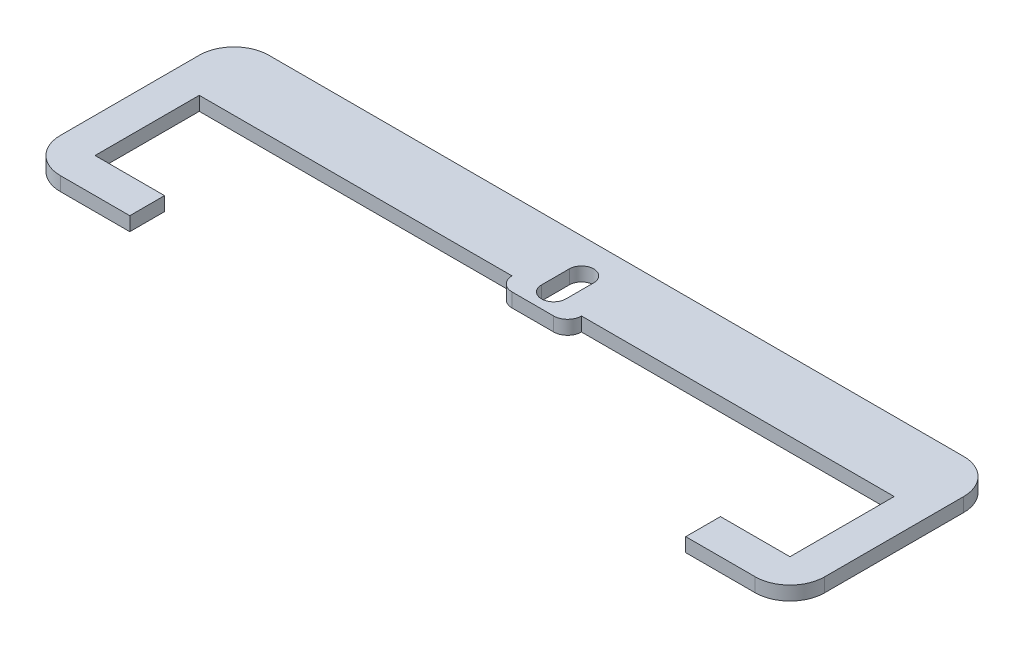
ISO-10303-21;
HEADER;
FILE_DESCRIPTION(('STEP AP214'),'2;1');
FILE_NAME('part.step','',(''),(''),'','','');
FILE_SCHEMA(('AUTOMOTIVE_DESIGN { 1 0 10303 214 1 1 1 1 }'));
ENDSEC;
DATA;
#1=APPLICATION_CONTEXT('core data for automotive mechanical design processes');
#2=APPLICATION_PROTOCOL_DEFINITION('international standard','automotive_design',2000,#1);
#3=PRODUCT_CONTEXT('',#1,'mechanical');
#4=PRODUCT('Part','Part','',(#3));
#5=PRODUCT_RELATED_PRODUCT_CATEGORY('part','',(#4));
#6=PRODUCT_DEFINITION_FORMATION('','',#4);
#7=PRODUCT_DEFINITION_CONTEXT('part definition',#1,'design');
#8=PRODUCT_DEFINITION('design','',#6,#7);
#9=PRODUCT_DEFINITION_SHAPE('','',#8);
#10=(LENGTH_UNIT() NAMED_UNIT(*) SI_UNIT(.MILLI.,.METRE.));
#11=(NAMED_UNIT(*) PLANE_ANGLE_UNIT() SI_UNIT($,.RADIAN.));
#12=(NAMED_UNIT(*) SI_UNIT($,.STERADIAN.) SOLID_ANGLE_UNIT());
#13=UNCERTAINTY_MEASURE_WITH_UNIT(LENGTH_MEASURE(1.E-05),#10,'distance_accuracy_value','');
#14=(GEOMETRIC_REPRESENTATION_CONTEXT(3) GLOBAL_UNCERTAINTY_ASSIGNED_CONTEXT((#13)) GLOBAL_UNIT_ASSIGNED_CONTEXT((#10,
#11,#12)) REPRESENTATION_CONTEXT('',''));
#15=CARTESIAN_POINT('',(0.,0.,0.));
#16=DIRECTION('',(0.,0.,1.));
#17=DIRECTION('',(1.,0.,0.));
#18=AXIS2_PLACEMENT_3D('',#15,#16,#17);
#19=CARTESIAN_POINT('',(127.,0.,-12.7));
#20=DIRECTION('',(0.,0.,-1.));
#21=DIRECTION('',(-1.,0.,0.));
#22=AXIS2_PLACEMENT_3D('',#19,#20,#21);
#23=PLANE('',#22);
#24=DIRECTION('',(0.,1.,0.));
#25=VECTOR('',#24,1.);
#26=CARTESIAN_POINT('',(12.7,0.,-12.7));
#27=LINE('',#26,#25);
#28=CARTESIAN_POINT('',(12.7,0.,-12.7));
#29=VERTEX_POINT('',#28);
#30=CARTESIAN_POINT('',(12.7,5.08,-12.7));
#31=VERTEX_POINT('',#30);
#32=EDGE_CURVE('E225',#29,#31,#27,.T.);
#33=ORIENTED_EDGE('',*,*,#32,.F.);
#34=DIRECTION('',(-1.,0.,0.));
#35=VECTOR('',#34,1.);
#36=CARTESIAN_POINT('',(127.,0.,-12.7));
#37=LINE('',#36,#35);
#38=CARTESIAN_POINT('',(127.,0.,-12.7));
#39=VERTEX_POINT('',#38);
#40=EDGE_CURVE('E273',#39,#29,#37,.T.);
#41=ORIENTED_EDGE('',*,*,#40,.F.);
#42=DIRECTION('',(0.,1.,0.));
#43=VECTOR('',#42,1.);
#44=CARTESIAN_POINT('',(127.,0.,-12.7));
#45=LINE('',#44,#43);
#46=CARTESIAN_POINT('',(127.,5.08,-12.7));
#47=VERTEX_POINT('',#46);
#48=EDGE_CURVE('E292',#39,#47,#45,.T.);
#49=ORIENTED_EDGE('',*,*,#48,.T.);
#50=DIRECTION('',(-1.,0.,0.));
#51=VECTOR('',#50,1.);
#52=CARTESIAN_POINT('',(127.,5.08,-12.7));
#53=LINE('',#52,#51);
#54=EDGE_CURVE('E265',#47,#31,#53,.T.);
#55=ORIENTED_EDGE('',*,*,#54,.T.);
#56=EDGE_LOOP('',(#33,#41,#49,#55));
#57=FACE_BOUND('',#56,.T.);
#58=ADVANCED_FACE('F32',(#57),#23,.F.);
#59=DIRECTION('',(0.,-1.,0.));
#60=VECTOR('',#59,1.);
#61=CARTESIAN_POINT('',(-12.7,0.,-12.7));
#62=LINE('',#61,#60);
#63=CARTESIAN_POINT('',(-12.7,5.08,-12.7));
#64=VERTEX_POINT('',#63);
#65=CARTESIAN_POINT('',(-12.7,0.,-12.7));
#66=VERTEX_POINT('',#65);
#67=EDGE_CURVE('E233',#64,#66,#62,.T.);
#68=ORIENTED_EDGE('',*,*,#67,.F.);
#69=CARTESIAN_POINT('',(-127.,5.08,-12.7));
#70=VERTEX_POINT('',#69);
#71=EDGE_CURVE('E285',#64,#70,#53,.T.);
#72=ORIENTED_EDGE('',*,*,#71,.T.);
#73=DIRECTION('',(0.,1.,0.));
#74=VECTOR('',#73,1.);
#75=CARTESIAN_POINT('',(-127.,0.,-12.7));
#76=LINE('',#75,#74);
#77=CARTESIAN_POINT('',(-127.,0.,-12.7));
#78=VERTEX_POINT('',#77);
#79=EDGE_CURVE('E288',#78,#70,#76,.T.);
#80=ORIENTED_EDGE('',*,*,#79,.F.);
#81=EDGE_CURVE('E272',#66,#78,#37,.T.);
#82=ORIENTED_EDGE('',*,*,#81,.F.);
#83=EDGE_LOOP('',(#68,#72,#80,#82));
#84=FACE_BOUND('',#83,.T.);
#85=ADVANCED_FACE('F392',(#84),#23,.F.);
#86=CARTESIAN_POINT('',(-139.7,5.08,38.1));
#87=DIRECTION('',(0.,0.,-1.));
#88=DIRECTION('',(-1.,0.,0.));
#89=AXIS2_PLACEMENT_3D('',#86,#87,#88);
#90=PLANE('',#89);
#91=DIRECTION('',(1.,0.,0.));
#92=VECTOR('',#91,1.);
#93=CARTESIAN_POINT('',(-139.7,5.08,38.1));
#94=LINE('',#93,#92);
#95=CARTESIAN_POINT('',(101.6,5.08,38.1));
#96=VERTEX_POINT('',#95);
#97=CARTESIAN_POINT('',(127.,5.08,38.1));
#98=VERTEX_POINT('',#97);
#99=EDGE_CURVE('E308',#96,#98,#94,.T.);
#100=ORIENTED_EDGE('',*,*,#99,.F.);
#101=DIRECTION('',(0.,1.,0.));
#102=VECTOR('',#101,1.);
#103=CARTESIAN_POINT('',(101.6,0.,38.1));
#104=LINE('',#103,#102);
#105=CARTESIAN_POINT('',(101.6,0.,38.1));
#106=VERTEX_POINT('',#105);
#107=EDGE_CURVE('E251',#106,#96,#104,.T.);
#108=ORIENTED_EDGE('',*,*,#107,.F.);
#109=DIRECTION('',(1.,0.,0.));
#110=VECTOR('',#109,1.);
#111=CARTESIAN_POINT('',(-139.7,0.,38.1));
#112=LINE('',#111,#110);
#113=CARTESIAN_POINT('',(127.,0.,38.1));
#114=VERTEX_POINT('',#113);
#115=EDGE_CURVE('E320',#106,#114,#112,.T.);
#116=ORIENTED_EDGE('',*,*,#115,.T.);
#117=DIRECTION('',(0.,-1.,0.));
#118=VECTOR('',#117,1.);
#119=CARTESIAN_POINT('',(127.,5.08,38.1));
#120=LINE('',#119,#118);
#121=EDGE_CURVE('E342',#114,#98,#120,.F.);
#122=ORIENTED_EDGE('',*,*,#121,.T.);
#123=EDGE_LOOP('',(#100,#108,#116,#122));
#124=FACE_BOUND('',#123,.T.);
#125=ADVANCED_FACE('F444',(#124),#90,.F.);
#126=CARTESIAN_POINT('',(127.,0.,25.4));
#127=DIRECTION('',(0.,0.,1.));
#128=DIRECTION('',(1.,0.,0.));
#129=AXIS2_PLACEMENT_3D('',#126,#127,#128);
#130=PLANE('',#129);
#131=DIRECTION('',(1.,0.,0.));
#132=VECTOR('',#131,1.);
#133=CARTESIAN_POINT('',(127.,0.,25.4));
#134=LINE('',#133,#132);
#135=CARTESIAN_POINT('',(101.6,0.,25.4));
#136=VERTEX_POINT('',#135);
#137=CARTESIAN_POINT('',(127.,0.,25.4));
#138=VERTEX_POINT('',#137);
#139=EDGE_CURVE('E264',#136,#138,#134,.T.);
#140=ORIENTED_EDGE('',*,*,#139,.F.);
#141=DIRECTION('',(0.,1.,0.));
#142=VECTOR('',#141,1.);
#143=CARTESIAN_POINT('',(101.6,0.,25.4));
#144=LINE('',#143,#142);
#145=CARTESIAN_POINT('',(101.6,5.08,25.4));
#146=VERTEX_POINT('',#145);
#147=EDGE_CURVE('E248',#136,#146,#144,.T.);
#148=ORIENTED_EDGE('',*,*,#147,.T.);
#149=DIRECTION('',(1.,0.,0.));
#150=VECTOR('',#149,1.);
#151=CARTESIAN_POINT('',(127.,5.08,25.4));
#152=LINE('',#151,#150);
#153=CARTESIAN_POINT('',(127.,5.08,25.4));
#154=VERTEX_POINT('',#153);
#155=EDGE_CURVE('E278',#146,#154,#152,.T.);
#156=ORIENTED_EDGE('',*,*,#155,.T.);
#157=DIRECTION('',(0.,1.,0.));
#158=VECTOR('',#157,1.);
#159=CARTESIAN_POINT('',(127.,0.,25.4));
#160=LINE('',#159,#158);
#161=EDGE_CURVE('E294',#138,#154,#160,.T.);
#162=ORIENTED_EDGE('',*,*,#161,.F.);
#163=EDGE_LOOP('',(#140,#148,#156,#162));
#164=FACE_BOUND('',#163,.T.);
#165=ADVANCED_FACE('F451',(#164),#130,.F.);
#166=CARTESIAN_POINT('',(139.7,5.08,38.1));
#167=DIRECTION('',(-1.,0.,0.));
#168=DIRECTION('',(0.,0.,1.));
#169=AXIS2_PLACEMENT_3D('',#166,#167,#168);
#170=PLANE('',#169);
#171=DIRECTION('',(0.,0.,-1.));
#172=VECTOR('',#171,1.);
#173=CARTESIAN_POINT('',(139.7,5.08,38.1));
#174=LINE('',#173,#172);
#175=CARTESIAN_POINT('',(139.7,5.08,25.4));
#176=VERTEX_POINT('',#175);
#177=CARTESIAN_POINT('',(139.7,5.08,-25.4));
#178=VERTEX_POINT('',#177);
#179=EDGE_CURVE('E299',#176,#178,#174,.T.);
#180=ORIENTED_EDGE('',*,*,#179,.F.);
#181=DIRECTION('',(0.,-1.,0.));
#182=VECTOR('',#181,1.);
#183=CARTESIAN_POINT('',(139.7,5.08,25.4));
#184=LINE('',#183,#182);
#185=CARTESIAN_POINT('',(139.7,0.,25.4));
#186=VERTEX_POINT('',#185);
#187=EDGE_CURVE('E359',#176,#186,#184,.T.);
#188=ORIENTED_EDGE('',*,*,#187,.T.);
#189=DIRECTION('',(0.,0.,-1.));
#190=VECTOR('',#189,1.);
#191=CARTESIAN_POINT('',(139.7,0.,38.1));
#192=LINE('',#191,#190);
#193=CARTESIAN_POINT('',(139.7,0.,-25.4));
#194=VERTEX_POINT('',#193);
#195=EDGE_CURVE('E291',#186,#194,#192,.T.);
#196=ORIENTED_EDGE('',*,*,#195,.T.);
#197=DIRECTION('',(0.,-1.,0.));
#198=VECTOR('',#197,1.);
#199=CARTESIAN_POINT('',(139.7,5.08,-25.4));
#200=LINE('',#199,#198);
#201=EDGE_CURVE('E339',#194,#178,#200,.F.);
#202=ORIENTED_EDGE('',*,*,#201,.T.);
#203=EDGE_LOOP('',(#180,#188,#196,#202));
#204=FACE_BOUND('',#203,.T.);
#205=ADVANCED_FACE('F437',(#204),#170,.F.);
#206=CARTESIAN_POINT('',(-139.7,5.08,-38.1));
#207=DIRECTION('',(0.,0.,1.));
#208=DIRECTION('',(1.,0.,0.));
#209=AXIS2_PLACEMENT_3D('',#206,#207,#208);
#210=PLANE('',#209);
#211=DIRECTION('',(-1.,0.,0.));
#212=VECTOR('',#211,1.);
#213=CARTESIAN_POINT('',(-139.7,0.,-38.1));
#214=LINE('',#213,#212);
#215=CARTESIAN_POINT('',(127.,0.,-38.1));
#216=VERTEX_POINT('',#215);
#217=CARTESIAN_POINT('',(-127.,0.,-38.1));
#218=VERTEX_POINT('',#217);
#219=EDGE_CURVE('E314',#216,#218,#214,.T.);
#220=ORIENTED_EDGE('',*,*,#219,.T.);
#221=DIRECTION('',(0.,-1.,0.));
#222=VECTOR('',#221,1.);
#223=CARTESIAN_POINT('',(-127.,5.08,-38.1));
#224=LINE('',#223,#222);
#225=CARTESIAN_POINT('',(-127.,5.08,-38.1));
#226=VERTEX_POINT('',#225);
#227=EDGE_CURVE('E333',#218,#226,#224,.F.);
#228=ORIENTED_EDGE('',*,*,#227,.T.);
#229=DIRECTION('',(-1.,0.,0.));
#230=VECTOR('',#229,1.);
#231=CARTESIAN_POINT('',(-139.7,5.08,-38.1));
#232=LINE('',#231,#230);
#233=CARTESIAN_POINT('',(127.,5.08,-38.1));
#234=VERTEX_POINT('',#233);
#235=EDGE_CURVE('E301',#234,#226,#232,.T.);
#236=ORIENTED_EDGE('',*,*,#235,.F.);
#237=DIRECTION('',(0.,-1.,0.));
#238=VECTOR('',#237,1.);
#239=CARTESIAN_POINT('',(127.,5.08,-38.1));
#240=LINE('',#239,#238);
#241=EDGE_CURVE('E330',#234,#216,#240,.T.);
#242=ORIENTED_EDGE('',*,*,#241,.T.);
#243=EDGE_LOOP('',(#220,#228,#236,#242));
#244=FACE_BOUND('',#243,.T.);
#245=ADVANCED_FACE('F425',(#244),#210,.F.);
#246=CARTESIAN_POINT('',(-139.7,5.08,38.1));
#247=DIRECTION('',(1.,0.,0.));
#248=DIRECTION('',(0.,0.,-1.));
#249=AXIS2_PLACEMENT_3D('',#246,#247,#248);
#250=PLANE('',#249);
#251=DIRECTION('',(0.,0.,1.));
#252=VECTOR('',#251,1.);
#253=CARTESIAN_POINT('',(-139.7,0.,38.1));
#254=LINE('',#253,#252);
#255=CARTESIAN_POINT('',(-139.7,0.,-25.4));
#256=VERTEX_POINT('',#255);
#257=CARTESIAN_POINT('',(-139.7,0.,25.4));
#258=VERTEX_POINT('',#257);
#259=EDGE_CURVE('E317',#256,#258,#254,.T.);
#260=ORIENTED_EDGE('',*,*,#259,.T.);
#261=DIRECTION('',(0.,-1.,0.));
#262=VECTOR('',#261,1.);
#263=CARTESIAN_POINT('',(-139.7,5.08,25.4));
#264=LINE('',#263,#262);
#265=CARTESIAN_POINT('',(-139.7,5.08,25.4));
#266=VERTEX_POINT('',#265);
#267=EDGE_CURVE('E353',#258,#266,#264,.F.);
#268=ORIENTED_EDGE('',*,*,#267,.T.);
#269=DIRECTION('',(0.,0.,1.));
#270=VECTOR('',#269,1.);
#271=CARTESIAN_POINT('',(-139.7,5.08,38.1));
#272=LINE('',#271,#270);
#273=CARTESIAN_POINT('',(-139.7,5.08,-25.4));
#274=VERTEX_POINT('',#273);
#275=EDGE_CURVE('E305',#274,#266,#272,.T.);
#276=ORIENTED_EDGE('',*,*,#275,.F.);
#277=DIRECTION('',(0.,-1.,0.));
#278=VECTOR('',#277,1.);
#279=CARTESIAN_POINT('',(-139.7,5.08,-25.4));
#280=LINE('',#279,#278);
#281=EDGE_CURVE('E312',#274,#256,#280,.T.);
#282=ORIENTED_EDGE('',*,*,#281,.T.);
#283=EDGE_LOOP('',(#260,#268,#276,#282));
#284=FACE_BOUND('',#283,.T.);
#285=ADVANCED_FACE('F416',(#284),#250,.F.);
#286=CARTESIAN_POINT('',(-127.,0.,38.1));
#287=VERTEX_POINT('',#286);
#288=CARTESIAN_POINT('',(-101.6,0.,38.1));
#289=VERTEX_POINT('',#288);
#290=EDGE_CURVE('E302',#287,#289,#112,.T.);
#291=ORIENTED_EDGE('',*,*,#290,.T.);
#292=DIRECTION('',(0.,1.,0.));
#293=VECTOR('',#292,1.);
#294=CARTESIAN_POINT('',(-101.6,0.,38.1));
#295=LINE('',#294,#293);
#296=CARTESIAN_POINT('',(-101.6,5.08,38.1));
#297=VERTEX_POINT('',#296);
#298=EDGE_CURVE('E254',#289,#297,#295,.T.);
#299=ORIENTED_EDGE('',*,*,#298,.T.);
#300=CARTESIAN_POINT('',(-127.,5.08,38.1));
#301=VERTEX_POINT('',#300);
#302=EDGE_CURVE('E309',#301,#297,#94,.T.);
#303=ORIENTED_EDGE('',*,*,#302,.F.);
#304=DIRECTION('',(0.,-1.,0.));
#305=VECTOR('',#304,1.);
#306=CARTESIAN_POINT('',(-127.,5.08,38.1));
#307=LINE('',#306,#305);
#308=EDGE_CURVE('E345',#301,#287,#307,.T.);
#309=ORIENTED_EDGE('',*,*,#308,.T.);
#310=EDGE_LOOP('',(#291,#299,#303,#309));
#311=FACE_BOUND('',#310,.T.);
#312=ADVANCED_FACE('F410',(#311),#90,.F.);
#313=CARTESIAN_POINT('',(0.,5.08,0.));
#314=DIRECTION('',(0.,-1.,0.));
#315=DIRECTION('',(0.,0.,-1.));
#316=AXIS2_PLACEMENT_3D('',#313,#314,#315);
#317=PLANE('',#316);
#318=DIRECTION('',(0.,0.,-1.));
#319=VECTOR('',#318,1.);
#320=CARTESIAN_POINT('',(4.445,5.08,-15.24));
#321=LINE('',#320,#319);
#322=CARTESIAN_POINT('',(4.445,5.08,-15.24));
#323=VERTEX_POINT('',#322);
#324=CARTESIAN_POINT('',(4.445,5.08,-25.4));
#325=VERTEX_POINT('',#324);
#326=EDGE_CURVE('E219',#323,#325,#321,.T.);
#327=ORIENTED_EDGE('',*,*,#326,.F.);
#328=CARTESIAN_POINT('',(0.,5.08,-15.24));
#329=DIRECTION('',(0.,1.,0.));
#330=DIRECTION('',(0.,0.,1.));
#331=AXIS2_PLACEMENT_3D('',#328,#329,#330);
#332=CIRCLE('',#331,4.445);
#333=CARTESIAN_POINT('',(-4.445,5.08,-15.24));
#334=VERTEX_POINT('',#333);
#335=EDGE_CURVE('E47',#334,#323,#332,.T.);
#336=ORIENTED_EDGE('',*,*,#335,.F.);
#337=DIRECTION('',(0.,0.,1.));
#338=VECTOR('',#337,1.);
#339=CARTESIAN_POINT('',(-4.445,5.08,-15.24));
#340=LINE('',#339,#338);
#341=CARTESIAN_POINT('',(-4.445,5.08,-25.4));
#342=VERTEX_POINT('',#341);
#343=EDGE_CURVE('E210',#342,#334,#340,.T.);
#344=ORIENTED_EDGE('',*,*,#343,.F.);
#345=CARTESIAN_POINT('',(0.,5.08,-25.4));
#346=DIRECTION('',(0.,1.,0.));
#347=DIRECTION('',(0.,0.,1.));
#348=AXIS2_PLACEMENT_3D('',#345,#346,#347);
#349=CIRCLE('',#348,4.445);
#350=EDGE_CURVE('E213',#325,#342,#349,.T.);
#351=ORIENTED_EDGE('',*,*,#350,.F.);
#352=EDGE_LOOP('',(#327,#336,#344,#351));
#353=FACE_BOUND('',#352,.T.);
#354=ORIENTED_EDGE('',*,*,#71,.F.);
#355=CARTESIAN_POINT('',(-7.62,5.08,-12.7));
#356=DIRECTION('',(0.,-1.,0.));
#357=DIRECTION('',(0.,0.,-1.));
#358=AXIS2_PLACEMENT_3D('',#355,#356,#357);
#359=CIRCLE('',#358,5.08);
#360=CARTESIAN_POINT('',(-7.62,5.08,-7.61999999999999));
#361=VERTEX_POINT('',#360);
#362=EDGE_CURVE('E11',#64,#361,#359,.F.);
#363=ORIENTED_EDGE('',*,*,#362,.T.);
#364=DIRECTION('',(-1.,0.,0.));
#365=VECTOR('',#364,1.);
#366=CARTESIAN_POINT('',(-12.7,5.08,-7.61999999999999));
#367=LINE('',#366,#365);
#368=CARTESIAN_POINT('',(7.62,5.08,-7.61999999999999));
#369=VERTEX_POINT('',#368);
#370=EDGE_CURVE('E229',#369,#361,#367,.T.);
#371=ORIENTED_EDGE('',*,*,#370,.F.);
#372=CARTESIAN_POINT('',(7.62,5.08,-12.7));
#373=DIRECTION('',(0.,-1.,0.));
#374=DIRECTION('',(0.,0.,-1.));
#375=AXIS2_PLACEMENT_3D('',#372,#373,#374);
#376=CIRCLE('',#375,5.08);
#377=EDGE_CURVE('E40',#369,#31,#376,.F.);
#378=ORIENTED_EDGE('',*,*,#377,.T.);
#379=ORIENTED_EDGE('',*,*,#54,.F.);
#380=DIRECTION('',(0.,0.,-1.));
#381=VECTOR('',#380,1.);
#382=CARTESIAN_POINT('',(127.,5.08,25.4));
#383=LINE('',#382,#381);
#384=EDGE_CURVE('E282',#154,#47,#383,.T.);
#385=ORIENTED_EDGE('',*,*,#384,.F.);
#386=ORIENTED_EDGE('',*,*,#155,.F.);
#387=DIRECTION('',(0.,0.,-1.));
#388=VECTOR('',#387,1.);
#389=CARTESIAN_POINT('',(101.6,5.08,38.1));
#390=LINE('',#389,#388);
#391=EDGE_CURVE('E236',#96,#146,#390,.T.);
#392=ORIENTED_EDGE('',*,*,#391,.F.);
#393=ORIENTED_EDGE('',*,*,#99,.T.);
#394=CARTESIAN_POINT('',(127.,5.08,25.4));
#395=DIRECTION('',(0.,-1.,0.));
#396=DIRECTION('',(0.,0.,-1.));
#397=AXIS2_PLACEMENT_3D('',#394,#395,#396);
#398=CIRCLE('',#397,12.7);
#399=EDGE_CURVE('E355',#98,#176,#398,.F.);
#400=ORIENTED_EDGE('',*,*,#399,.T.);
#401=ORIENTED_EDGE('',*,*,#179,.T.);
#402=CARTESIAN_POINT('',(127.,5.08,-25.4));
#403=DIRECTION('',(0.,-1.,0.));
#404=DIRECTION('',(0.,0.,-1.));
#405=AXIS2_PLACEMENT_3D('',#402,#403,#404);
#406=CIRCLE('',#405,12.7);
#407=EDGE_CURVE('E335',#178,#234,#406,.F.);
#408=ORIENTED_EDGE('',*,*,#407,.T.);
#409=ORIENTED_EDGE('',*,*,#235,.T.);
#410=CARTESIAN_POINT('',(-127.,5.08,-25.4));
#411=DIRECTION('',(0.,-1.,0.));
#412=DIRECTION('',(0.,0.,-1.));
#413=AXIS2_PLACEMENT_3D('',#410,#411,#412);
#414=CIRCLE('',#413,12.7);
#415=EDGE_CURVE('E337',#226,#274,#414,.F.);
#416=ORIENTED_EDGE('',*,*,#415,.T.);
#417=ORIENTED_EDGE('',*,*,#275,.T.);
#418=CARTESIAN_POINT('',(-127.,5.08,25.4));
#419=DIRECTION('',(0.,-1.,0.));
#420=DIRECTION('',(0.,0.,-1.));
#421=AXIS2_PLACEMENT_3D('',#418,#419,#420);
#422=CIRCLE('',#421,12.7);
#423=EDGE_CURVE('E357',#266,#301,#422,.F.);
#424=ORIENTED_EDGE('',*,*,#423,.T.);
#425=ORIENTED_EDGE('',*,*,#302,.T.);
#426=DIRECTION('',(0.,0.,1.));
#427=VECTOR('',#426,1.);
#428=CARTESIAN_POINT('',(-101.6,5.08,38.1));
#429=LINE('',#428,#427);
#430=CARTESIAN_POINT('',(-101.6,5.08,25.4));
#431=VERTEX_POINT('',#430);
#432=EDGE_CURVE('E245',#431,#297,#429,.T.);
#433=ORIENTED_EDGE('',*,*,#432,.F.);
#434=CARTESIAN_POINT('',(-127.,5.08,25.4));
#435=VERTEX_POINT('',#434);
#436=EDGE_CURVE('E279',#435,#431,#152,.T.);
#437=ORIENTED_EDGE('',*,*,#436,.F.);
#438=DIRECTION('',(0.,0.,1.));
#439=VECTOR('',#438,1.);
#440=CARTESIAN_POINT('',(-127.,5.08,25.4));
#441=LINE('',#440,#439);
#442=EDGE_CURVE('E253',#70,#435,#441,.T.);
#443=ORIENTED_EDGE('',*,*,#442,.F.);
#444=EDGE_LOOP('',(#354,#363,#371,#378,#379,#385,#386,#392,#393,#400,#401,#408,#409,#416,#417,
#424,#425,#433,#437,#443));
#445=FACE_BOUND('',#444,.T.);
#446=ADVANCED_FACE('F375',(#353,#445),#317,.F.);
#447=CARTESIAN_POINT('',(0.,0.,0.));
#448=DIRECTION('',(0.,-1.,0.));
#449=DIRECTION('',(0.,0.,-1.));
#450=AXIS2_PLACEMENT_3D('',#447,#448,#449);
#451=PLANE('',#450);
#452=CARTESIAN_POINT('',(0.,0.,-15.24));
#453=DIRECTION('',(0.,1.,0.));
#454=DIRECTION('',(0.,0.,1.));
#455=AXIS2_PLACEMENT_3D('',#452,#453,#454);
#456=CIRCLE('',#455,4.445);
#457=CARTESIAN_POINT('',(-4.445,0.,-15.24));
#458=VERTEX_POINT('',#457);
#459=CARTESIAN_POINT('',(4.445,0.,-15.24));
#460=VERTEX_POINT('',#459);
#461=EDGE_CURVE('E194',#458,#460,#456,.T.);
#462=ORIENTED_EDGE('',*,*,#461,.T.);
#463=DIRECTION('',(0.,0.,-1.));
#464=VECTOR('',#463,1.);
#465=CARTESIAN_POINT('',(4.445,0.,-15.24));
#466=LINE('',#465,#464);
#467=CARTESIAN_POINT('',(4.445,0.,-25.4));
#468=VERTEX_POINT('',#467);
#469=EDGE_CURVE('E203',#460,#468,#466,.T.);
#470=ORIENTED_EDGE('',*,*,#469,.T.);
#471=CARTESIAN_POINT('',(0.,0.,-25.4));
#472=DIRECTION('',(0.,1.,0.));
#473=DIRECTION('',(0.,0.,1.));
#474=AXIS2_PLACEMENT_3D('',#471,#472,#473);
#475=CIRCLE('',#474,4.445);
#476=CARTESIAN_POINT('',(-4.445,0.,-25.4));
#477=VERTEX_POINT('',#476);
#478=EDGE_CURVE('E55',#468,#477,#475,.T.);
#479=ORIENTED_EDGE('',*,*,#478,.T.);
#480=DIRECTION('',(0.,0.,1.));
#481=VECTOR('',#480,1.);
#482=CARTESIAN_POINT('',(-4.445,0.,-15.24));
#483=LINE('',#482,#481);
#484=EDGE_CURVE('E200',#477,#458,#483,.T.);
#485=ORIENTED_EDGE('',*,*,#484,.T.);
#486=EDGE_LOOP('',(#462,#470,#479,#485));
#487=FACE_BOUND('',#486,.T.);
#488=DIRECTION('',(1.,0.,0.));
#489=VECTOR('',#488,1.);
#490=CARTESIAN_POINT('',(-12.7,0.,-7.61999999999999));
#491=LINE('',#490,#489);
#492=CARTESIAN_POINT('',(-7.62000000000001,0.,-7.61999999999999));
#493=VERTEX_POINT('',#492);
#494=CARTESIAN_POINT('',(7.61999999999999,0.,-7.61999999999999));
#495=VERTEX_POINT('',#494);
#496=EDGE_CURVE('E232',#493,#495,#491,.T.);
#497=ORIENTED_EDGE('',*,*,#496,.F.);
#498=CARTESIAN_POINT('',(-7.62,0.,-12.7));
#499=DIRECTION('',(0.,-1.,0.));
#500=DIRECTION('',(0.,0.,-1.));
#501=AXIS2_PLACEMENT_3D('',#498,#499,#500);
#502=CIRCLE('',#501,5.08);
#503=EDGE_CURVE('E370',#493,#66,#502,.T.);
#504=ORIENTED_EDGE('',*,*,#503,.T.);
#505=ORIENTED_EDGE('',*,*,#81,.T.);
#506=DIRECTION('',(0.,0.,1.));
#507=VECTOR('',#506,1.);
#508=CARTESIAN_POINT('',(-127.,0.,25.4));
#509=LINE('',#508,#507);
#510=CARTESIAN_POINT('',(-127.,0.,25.4));
#511=VERTEX_POINT('',#510);
#512=EDGE_CURVE('E261',#78,#511,#509,.T.);
#513=ORIENTED_EDGE('',*,*,#512,.T.);
#514=CARTESIAN_POINT('',(-101.6,0.,25.4));
#515=VERTEX_POINT('',#514);
#516=EDGE_CURVE('E266',#511,#515,#134,.T.);
#517=ORIENTED_EDGE('',*,*,#516,.T.);
#518=DIRECTION('',(0.,0.,1.));
#519=VECTOR('',#518,1.);
#520=CARTESIAN_POINT('',(-101.6,0.,38.1));
#521=LINE('',#520,#519);
#522=EDGE_CURVE('E244',#515,#289,#521,.T.);
#523=ORIENTED_EDGE('',*,*,#522,.T.);
#524=ORIENTED_EDGE('',*,*,#290,.F.);
#525=CARTESIAN_POINT('',(-127.,0.,25.4));
#526=DIRECTION('',(0.,-1.,0.));
#527=DIRECTION('',(0.,0.,-1.));
#528=AXIS2_PLACEMENT_3D('',#525,#526,#527);
#529=CIRCLE('',#528,12.7);
#530=EDGE_CURVE('E351',#287,#258,#529,.T.);
#531=ORIENTED_EDGE('',*,*,#530,.T.);
#532=ORIENTED_EDGE('',*,*,#259,.F.);
#533=CARTESIAN_POINT('',(-127.,0.,-25.4));
#534=DIRECTION('',(0.,-1.,0.));
#535=DIRECTION('',(0.,0.,-1.));
#536=AXIS2_PLACEMENT_3D('',#533,#534,#535);
#537=CIRCLE('',#536,12.7);
#538=EDGE_CURVE('E328',#256,#218,#537,.T.);
#539=ORIENTED_EDGE('',*,*,#538,.T.);
#540=ORIENTED_EDGE('',*,*,#219,.F.);
#541=CARTESIAN_POINT('',(127.,0.,-25.4));
#542=DIRECTION('',(0.,-1.,0.));
#543=DIRECTION('',(0.,0.,-1.));
#544=AXIS2_PLACEMENT_3D('',#541,#542,#543);
#545=CIRCLE('',#544,12.7);
#546=EDGE_CURVE('E325',#216,#194,#545,.T.);
#547=ORIENTED_EDGE('',*,*,#546,.T.);
#548=ORIENTED_EDGE('',*,*,#195,.F.);
#549=CARTESIAN_POINT('',(127.,0.,25.4));
#550=DIRECTION('',(0.,-1.,0.));
#551=DIRECTION('',(0.,0.,-1.));
#552=AXIS2_PLACEMENT_3D('',#549,#550,#551);
#553=CIRCLE('',#552,12.7);
#554=EDGE_CURVE('E348',#186,#114,#553,.T.);
#555=ORIENTED_EDGE('',*,*,#554,.T.);
#556=ORIENTED_EDGE('',*,*,#115,.F.);
#557=DIRECTION('',(0.,0.,-1.));
#558=VECTOR('',#557,1.);
#559=CARTESIAN_POINT('',(101.6,0.,38.1));
#560=LINE('',#559,#558);
#561=EDGE_CURVE('E241',#106,#136,#560,.T.);
#562=ORIENTED_EDGE('',*,*,#561,.T.);
#563=ORIENTED_EDGE('',*,*,#139,.T.);
#564=DIRECTION('',(0.,0.,-1.));
#565=VECTOR('',#564,1.);
#566=CARTESIAN_POINT('',(127.,0.,25.4));
#567=LINE('',#566,#565);
#568=EDGE_CURVE('E269',#138,#39,#567,.T.);
#569=ORIENTED_EDGE('',*,*,#568,.T.);
#570=ORIENTED_EDGE('',*,*,#40,.T.);
#571=CARTESIAN_POINT('',(7.62,0.,-12.7));
#572=DIRECTION('',(0.,-1.,0.));
#573=DIRECTION('',(0.,0.,-1.));
#574=AXIS2_PLACEMENT_3D('',#571,#572,#573);
#575=CIRCLE('',#574,5.08);
#576=EDGE_CURVE('E368',#29,#495,#575,.T.);
#577=ORIENTED_EDGE('',*,*,#576,.T.);
#578=EDGE_LOOP('',(#497,#504,#505,#513,#517,#523,#524,#531,#532,#539,#540,#547,#548,#555,#556,
#562,#563,#569,#570,#577));
#579=FACE_BOUND('',#578,.T.);
#580=ADVANCED_FACE('F207',(#487,#579),#451,.T.);
#581=CARTESIAN_POINT('',(-127.,0.,25.4));
#582=DIRECTION('',(-1.,0.,0.));
#583=DIRECTION('',(0.,0.,1.));
#584=AXIS2_PLACEMENT_3D('',#581,#582,#583);
#585=PLANE('',#584);
#586=ORIENTED_EDGE('',*,*,#442,.T.);
#587=DIRECTION('',(0.,1.,0.));
#588=VECTOR('',#587,1.);
#589=CARTESIAN_POINT('',(-127.,0.,25.4));
#590=LINE('',#589,#588);
#591=EDGE_CURVE('E276',#511,#435,#590,.T.);
#592=ORIENTED_EDGE('',*,*,#591,.F.);
#593=ORIENTED_EDGE('',*,*,#512,.F.);
#594=ORIENTED_EDGE('',*,*,#79,.T.);
#595=EDGE_LOOP('',(#586,#592,#593,#594));
#596=FACE_BOUND('',#595,.T.);
#597=ADVANCED_FACE('F396',(#596),#585,.F.);
#598=CARTESIAN_POINT('',(127.,0.,25.4));
#599=DIRECTION('',(1.,0.,0.));
#600=DIRECTION('',(0.,0.,-1.));
#601=AXIS2_PLACEMENT_3D('',#598,#599,#600);
#602=PLANE('',#601);
#603=ORIENTED_EDGE('',*,*,#384,.T.);
#604=ORIENTED_EDGE('',*,*,#48,.F.);
#605=ORIENTED_EDGE('',*,*,#568,.F.);
#606=ORIENTED_EDGE('',*,*,#161,.T.);
#607=EDGE_LOOP('',(#603,#604,#605,#606));
#608=FACE_BOUND('',#607,.T.);
#609=ADVANCED_FACE('F454',(#608),#602,.F.);
#610=ORIENTED_EDGE('',*,*,#436,.T.);
#611=DIRECTION('',(0.,1.,0.));
#612=VECTOR('',#611,1.);
#613=CARTESIAN_POINT('',(-101.6,0.,25.4));
#614=LINE('',#613,#612);
#615=EDGE_CURVE('E257',#515,#431,#614,.T.);
#616=ORIENTED_EDGE('',*,*,#615,.F.);
#617=ORIENTED_EDGE('',*,*,#516,.F.);
#618=ORIENTED_EDGE('',*,*,#591,.T.);
#619=EDGE_LOOP('',(#610,#616,#617,#618));
#620=FACE_BOUND('',#619,.T.);
#621=ADVANCED_FACE('F401',(#620),#130,.F.);
#622=CARTESIAN_POINT('',(-127.,5.08,-25.4));
#623=DIRECTION('',(0.,-1.,0.));
#624=DIRECTION('',(0.,0.,-1.));
#625=AXIS2_PLACEMENT_3D('',#622,#623,#624);
#626=CYLINDRICAL_SURFACE('',#625,12.7);
#627=ORIENTED_EDGE('',*,*,#415,.F.);
#628=ORIENTED_EDGE('',*,*,#227,.F.);
#629=ORIENTED_EDGE('',*,*,#538,.F.);
#630=ORIENTED_EDGE('',*,*,#281,.F.);
#631=EDGE_LOOP('',(#627,#628,#629,#630));
#632=FACE_BOUND('',#631,.T.);
#633=ADVANCED_FACE('F421',(#632),#626,.T.);
#634=CARTESIAN_POINT('',(127.,5.08,-25.4));
#635=DIRECTION('',(0.,-1.,0.));
#636=DIRECTION('',(0.,0.,-1.));
#637=AXIS2_PLACEMENT_3D('',#634,#635,#636);
#638=CYLINDRICAL_SURFACE('',#637,12.7);
#639=ORIENTED_EDGE('',*,*,#407,.F.);
#640=ORIENTED_EDGE('',*,*,#201,.F.);
#641=ORIENTED_EDGE('',*,*,#546,.F.);
#642=ORIENTED_EDGE('',*,*,#241,.F.);
#643=EDGE_LOOP('',(#639,#640,#641,#642));
#644=FACE_BOUND('',#643,.T.);
#645=ADVANCED_FACE('F430',(#644),#638,.T.);
#646=CARTESIAN_POINT('',(-127.,5.08,25.4));
#647=DIRECTION('',(0.,-1.,0.));
#648=DIRECTION('',(0.,0.,-1.));
#649=AXIS2_PLACEMENT_3D('',#646,#647,#648);
#650=CYLINDRICAL_SURFACE('',#649,12.7);
#651=ORIENTED_EDGE('',*,*,#423,.F.);
#652=ORIENTED_EDGE('',*,*,#267,.F.);
#653=ORIENTED_EDGE('',*,*,#530,.F.);
#654=ORIENTED_EDGE('',*,*,#308,.F.);
#655=EDGE_LOOP('',(#651,#652,#653,#654));
#656=FACE_BOUND('',#655,.T.);
#657=ADVANCED_FACE('F412',(#656),#650,.T.);
#658=CARTESIAN_POINT('',(127.,5.08,25.4));
#659=DIRECTION('',(0.,-1.,0.));
#660=DIRECTION('',(0.,0.,-1.));
#661=AXIS2_PLACEMENT_3D('',#658,#659,#660);
#662=CYLINDRICAL_SURFACE('',#661,12.7);
#663=ORIENTED_EDGE('',*,*,#399,.F.);
#664=ORIENTED_EDGE('',*,*,#121,.F.);
#665=ORIENTED_EDGE('',*,*,#554,.F.);
#666=ORIENTED_EDGE('',*,*,#187,.F.);
#667=EDGE_LOOP('',(#663,#664,#665,#666));
#668=FACE_BOUND('',#667,.T.);
#669=ADVANCED_FACE('F441',(#668),#662,.T.);
#670=CARTESIAN_POINT('',(-101.6,0.,38.1));
#671=DIRECTION('',(-1.,0.,0.));
#672=DIRECTION('',(0.,0.,1.));
#673=AXIS2_PLACEMENT_3D('',#670,#671,#672);
#674=PLANE('',#673);
#675=ORIENTED_EDGE('',*,*,#432,.T.);
#676=ORIENTED_EDGE('',*,*,#298,.F.);
#677=ORIENTED_EDGE('',*,*,#522,.F.);
#678=ORIENTED_EDGE('',*,*,#615,.T.);
#679=EDGE_LOOP('',(#675,#676,#677,#678));
#680=FACE_BOUND('',#679,.T.);
#681=ADVANCED_FACE('F405',(#680),#674,.F.);
#682=CARTESIAN_POINT('',(101.6,0.,38.1));
#683=DIRECTION('',(1.,0.,0.));
#684=DIRECTION('',(0.,0.,-1.));
#685=AXIS2_PLACEMENT_3D('',#682,#683,#684);
#686=PLANE('',#685);
#687=ORIENTED_EDGE('',*,*,#391,.T.);
#688=ORIENTED_EDGE('',*,*,#147,.F.);
#689=ORIENTED_EDGE('',*,*,#561,.F.);
#690=ORIENTED_EDGE('',*,*,#107,.T.);
#691=EDGE_LOOP('',(#687,#688,#689,#690));
#692=FACE_BOUND('',#691,.T.);
#693=ADVANCED_FACE('F456',(#692),#686,.F.);
#694=CARTESIAN_POINT('',(0.,0.,-7.61999999999999));
#695=DIRECTION('',(0.,0.,-1.));
#696=DIRECTION('',(-1.,0.,0.));
#697=AXIS2_PLACEMENT_3D('',#694,#695,#696);
#698=PLANE('',#697);
#699=ORIENTED_EDGE('',*,*,#370,.T.);
#700=DIRECTION('',(0.,-1.,0.));
#701=VECTOR('',#700,1.);
#702=CARTESIAN_POINT('',(-7.62,0.,-7.61999999999999));
#703=LINE('',#702,#701);
#704=EDGE_CURVE('E365',#361,#493,#703,.T.);
#705=ORIENTED_EDGE('',*,*,#704,.T.);
#706=ORIENTED_EDGE('',*,*,#496,.T.);
#707=DIRECTION('',(0.,1.,0.));
#708=VECTOR('',#707,1.);
#709=CARTESIAN_POINT('',(7.62,0.,-7.61999999999999));
#710=LINE('',#709,#708);
#711=EDGE_CURVE('E362',#495,#369,#710,.T.);
#712=ORIENTED_EDGE('',*,*,#711,.T.);
#713=EDGE_LOOP('',(#699,#705,#706,#712));
#714=FACE_BOUND('',#713,.T.);
#715=ADVANCED_FACE('F384',(#714),#698,.F.);
#716=CARTESIAN_POINT('',(-7.62,0.,-12.7));
#717=DIRECTION('',(0.,-1.,0.));
#718=DIRECTION('',(1.,0.,0.));
#719=AXIS2_PLACEMENT_3D('',#716,#717,#718);
#720=CYLINDRICAL_SURFACE('',#719,5.08);
#721=ORIENTED_EDGE('',*,*,#362,.F.);
#722=ORIENTED_EDGE('',*,*,#67,.T.);
#723=ORIENTED_EDGE('',*,*,#503,.F.);
#724=ORIENTED_EDGE('',*,*,#704,.F.);
#725=EDGE_LOOP('',(#721,#722,#723,#724));
#726=FACE_BOUND('',#725,.T.);
#727=ADVANCED_FACE('F388',(#726),#720,.T.);
#728=CARTESIAN_POINT('',(7.62,0.,-12.7));
#729=DIRECTION('',(0.,1.,0.));
#730=DIRECTION('',(0.,0.,1.));
#731=AXIS2_PLACEMENT_3D('',#728,#729,#730);
#732=CYLINDRICAL_SURFACE('',#731,5.08);
#733=ORIENTED_EDGE('',*,*,#576,.F.);
#734=ORIENTED_EDGE('',*,*,#32,.T.);
#735=ORIENTED_EDGE('',*,*,#377,.F.);
#736=ORIENTED_EDGE('',*,*,#711,.F.);
#737=EDGE_LOOP('',(#733,#734,#735,#736));
#738=FACE_BOUND('',#737,.T.);
#739=ADVANCED_FACE('F34',(#738),#732,.T.);
#740=CARTESIAN_POINT('',(0.,0.,-15.24));
#741=DIRECTION('',(0.,1.,0.));
#742=DIRECTION('',(0.,0.,1.));
#743=AXIS2_PLACEMENT_3D('',#740,#741,#742);
#744=CYLINDRICAL_SURFACE('',#743,4.445);
#745=ORIENTED_EDGE('',*,*,#335,.T.);
#746=DIRECTION('',(0.,1.,0.));
#747=VECTOR('',#746,1.);
#748=CARTESIAN_POINT('',(4.445,0.,-15.24));
#749=LINE('',#748,#747);
#750=EDGE_CURVE('E190',#460,#323,#749,.T.);
#751=ORIENTED_EDGE('',*,*,#750,.F.);
#752=ORIENTED_EDGE('',*,*,#461,.F.);
#753=DIRECTION('',(0.,1.,0.));
#754=VECTOR('',#753,1.);
#755=CARTESIAN_POINT('',(-4.445,0.,-15.24));
#756=LINE('',#755,#754);
#757=EDGE_CURVE('E223',#458,#334,#756,.T.);
#758=ORIENTED_EDGE('',*,*,#757,.T.);
#759=EDGE_LOOP('',(#745,#751,#752,#758));
#760=FACE_BOUND('',#759,.T.);
#761=ADVANCED_FACE('F192',(#760),#744,.F.);
#762=CARTESIAN_POINT('',(-4.445,0.,-15.24));
#763=DIRECTION('',(-1.,0.,0.));
#764=DIRECTION('',(0.,0.,1.));
#765=AXIS2_PLACEMENT_3D('',#762,#763,#764);
#766=PLANE('',#765);
#767=ORIENTED_EDGE('',*,*,#343,.T.);
#768=ORIENTED_EDGE('',*,*,#757,.F.);
#769=ORIENTED_EDGE('',*,*,#484,.F.);
#770=DIRECTION('',(0.,1.,0.));
#771=VECTOR('',#770,1.);
#772=CARTESIAN_POINT('',(-4.445,0.,-25.4));
#773=LINE('',#772,#771);
#774=EDGE_CURVE('E226',#477,#342,#773,.T.);
#775=ORIENTED_EDGE('',*,*,#774,.T.);
#776=EDGE_LOOP('',(#767,#768,#769,#775));
#777=FACE_BOUND('',#776,.T.);
#778=ADVANCED_FACE('F504',(#777),#766,.F.);
#779=CARTESIAN_POINT('',(0.,0.,-25.4));
#780=DIRECTION('',(0.,1.,0.));
#781=DIRECTION('',(0.,0.,1.));
#782=AXIS2_PLACEMENT_3D('',#779,#780,#781);
#783=CYLINDRICAL_SURFACE('',#782,4.445);
#784=ORIENTED_EDGE('',*,*,#350,.T.);
#785=ORIENTED_EDGE('',*,*,#774,.F.);
#786=ORIENTED_EDGE('',*,*,#478,.F.);
#787=DIRECTION('',(0.,1.,0.));
#788=VECTOR('',#787,1.);
#789=CARTESIAN_POINT('',(4.445,0.,-25.4));
#790=LINE('',#789,#788);
#791=EDGE_CURVE('E199',#468,#325,#790,.T.);
#792=ORIENTED_EDGE('',*,*,#791,.T.);
#793=EDGE_LOOP('',(#784,#785,#786,#792));
#794=FACE_BOUND('',#793,.T.);
#795=ADVANCED_FACE('F509',(#794),#783,.F.);
#796=CARTESIAN_POINT('',(4.445,0.,-15.24));
#797=DIRECTION('',(1.,0.,0.));
#798=DIRECTION('',(0.,0.,-1.));
#799=AXIS2_PLACEMENT_3D('',#796,#797,#798);
#800=PLANE('',#799);
#801=ORIENTED_EDGE('',*,*,#326,.T.);
#802=ORIENTED_EDGE('',*,*,#791,.F.);
#803=ORIENTED_EDGE('',*,*,#469,.F.);
#804=ORIENTED_EDGE('',*,*,#750,.T.);
#805=EDGE_LOOP('',(#801,#802,#803,#804));
#806=FACE_BOUND('',#805,.T.);
#807=ADVANCED_FACE('F204',(#806),#800,.F.);
#808=CLOSED_SHELL('',(#58,#85,#125,#165,#205,#245,#285,#312,#446,#580,#597,#609,#621,#633,#645,
#657,#669,#681,#693,#715,#727,#739,#761,#778,#795,#807));
#809=MANIFOLD_SOLID_BREP('B2',#808);
#810=ADVANCED_BREP_SHAPE_REPRESENTATION('',(#18,#809),#14);
#811=SHAPE_DEFINITION_REPRESENTATION(#9,#810);
ENDSEC;
END-ISO-10303-21;
